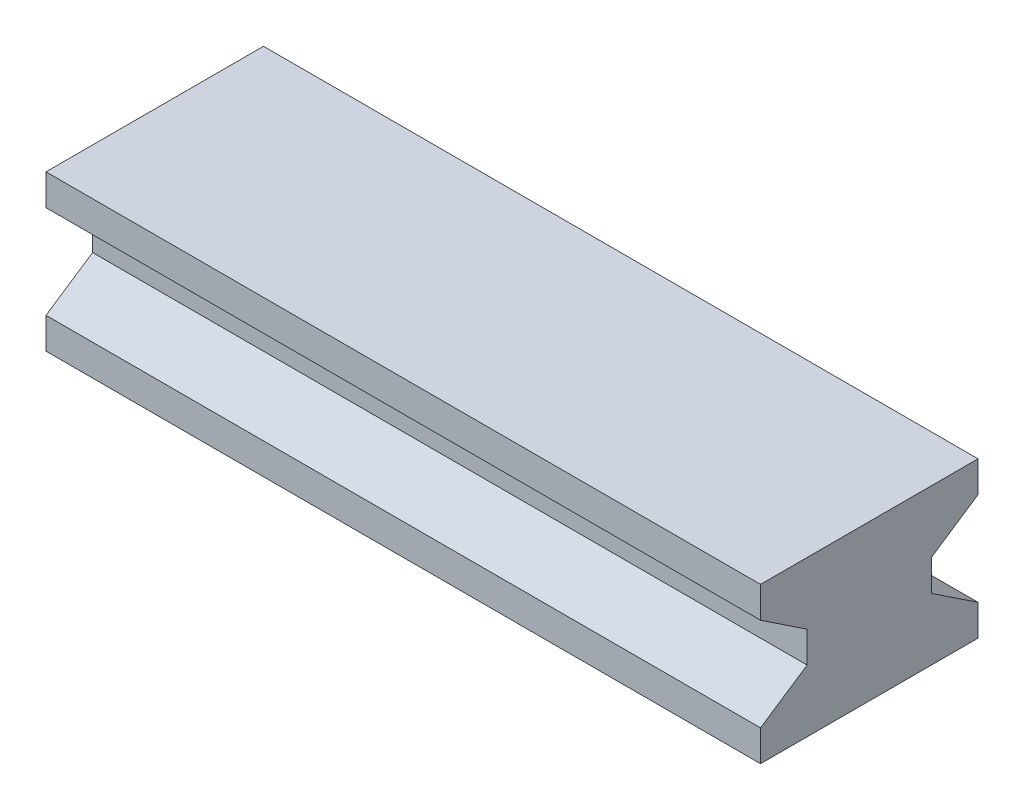
ISO-10303-21;
HEADER;
FILE_DESCRIPTION(('STEP AP214'),'2;1');
FILE_NAME('part.step','',(''),(''),'','','');
FILE_SCHEMA(('AUTOMOTIVE_DESIGN { 1 0 10303 214 1 1 1 1 }'));
ENDSEC;
DATA;
#1=APPLICATION_CONTEXT('core data for automotive mechanical design processes');
#2=APPLICATION_PROTOCOL_DEFINITION('international standard','automotive_design',2000,#1);
#3=PRODUCT_CONTEXT('',#1,'mechanical');
#4=PRODUCT('Part','Part','',(#3));
#5=PRODUCT_RELATED_PRODUCT_CATEGORY('part','',(#4));
#6=PRODUCT_DEFINITION_FORMATION('','',#4);
#7=PRODUCT_DEFINITION_CONTEXT('part definition',#1,'design');
#8=PRODUCT_DEFINITION('design','',#6,#7);
#9=PRODUCT_DEFINITION_SHAPE('','',#8);
#10=(LENGTH_UNIT() NAMED_UNIT(*) SI_UNIT(.MILLI.,.METRE.));
#11=(NAMED_UNIT(*) PLANE_ANGLE_UNIT() SI_UNIT($,.RADIAN.));
#12=(NAMED_UNIT(*) SI_UNIT($,.STERADIAN.) SOLID_ANGLE_UNIT());
#13=UNCERTAINTY_MEASURE_WITH_UNIT(LENGTH_MEASURE(1.E-05),#10,'distance_accuracy_value','');
#14=(GEOMETRIC_REPRESENTATION_CONTEXT(3) GLOBAL_UNCERTAINTY_ASSIGNED_CONTEXT((#13)) GLOBAL_UNIT_ASSIGNED_CONTEXT((#10,
#11,#12)) REPRESENTATION_CONTEXT('',''));
#15=CARTESIAN_POINT('',(0.,0.,0.));
#16=DIRECTION('',(0.,0.,1.));
#17=DIRECTION('',(1.,0.,0.));
#18=AXIS2_PLACEMENT_3D('',#15,#16,#17);
#19=CARTESIAN_POINT('',(230.,-5.76923076922906,-3.84615384615075));
#20=DIRECTION('',(0.,-0.832050294337974,-0.554700196225034));
#21=DIRECTION('',(0.,0.554700196225034,-0.832050294337974));
#22=AXIS2_PLACEMENT_3D('',#19,#20,#21);
#23=PLANE('',#22);
#24=DIRECTION('',(0.,-0.554700196225034,0.832050294337974));
#25=VECTOR('',#24,1.);
#26=CARTESIAN_POINT('',(0.,-5.76923076922906,-3.84615384615075));
#27=LINE('',#26,#25);
#28=CARTESIAN_POINT('',(0.,14.9999999999932,-35.));
#29=VERTEX_POINT('',#28);
#30=CARTESIAN_POINT('',(0.,4.99999999999984,-20.0000000000023));
#31=VERTEX_POINT('',#30);
#32=EDGE_CURVE('E157',#29,#31,#27,.T.);
#33=ORIENTED_EDGE('',*,*,#32,.F.);
#34=DIRECTION('',(-1.,0.,0.));
#35=VECTOR('',#34,1.);
#36=CARTESIAN_POINT('',(230.,14.9999999999932,-35.));
#37=LINE('',#36,#35);
#38=CARTESIAN_POINT('',(230.,14.9999999999932,-35.));
#39=VERTEX_POINT('',#38);
#40=EDGE_CURVE('E11',#39,#29,#37,.T.);
#41=ORIENTED_EDGE('',*,*,#40,.F.);
#42=DIRECTION('',(0.,-0.554700196225034,0.832050294337974));
#43=VECTOR('',#42,1.);
#44=CARTESIAN_POINT('',(230.,-5.76923076922906,-3.84615384615075));
#45=LINE('',#44,#43);
#46=CARTESIAN_POINT('',(230.,4.99999999999984,-20.0000000000023));
#47=VERTEX_POINT('',#46);
#48=EDGE_CURVE('E185',#39,#47,#45,.T.);
#49=ORIENTED_EDGE('',*,*,#48,.T.);
#50=DIRECTION('',(-1.,0.,0.));
#51=VECTOR('',#50,1.);
#52=CARTESIAN_POINT('',(230.,4.99999999999984,-20.0000000000023));
#53=LINE('',#52,#51);
#54=EDGE_CURVE('E52',#47,#31,#53,.T.);
#55=ORIENTED_EDGE('',*,*,#54,.T.);
#56=EDGE_LOOP('',(#33,#41,#49,#55));
#57=FACE_BOUND('',#56,.T.);
#58=ADVANCED_FACE('F36',(#57),#23,.T.);
#59=CARTESIAN_POINT('',(230.,0.,-35.));
#60=DIRECTION('',(0.,0.,1.));
#61=DIRECTION('',(1.,0.,0.));
#62=AXIS2_PLACEMENT_3D('',#59,#60,#61);
#63=PLANE('',#62);
#64=DIRECTION('',(0.,1.,0.));
#65=VECTOR('',#64,1.);
#66=CARTESIAN_POINT('',(0.,0.,-35.));
#67=LINE('',#66,#65);
#68=CARTESIAN_POINT('',(0.,25.,-35.));
#69=VERTEX_POINT('',#68);
#70=EDGE_CURVE('E159',#29,#69,#67,.T.);
#71=ORIENTED_EDGE('',*,*,#70,.T.);
#72=DIRECTION('',(-1.,0.,0.));
#73=VECTOR('',#72,1.);
#74=CARTESIAN_POINT('',(230.,25.,-35.));
#75=LINE('',#74,#73);
#76=CARTESIAN_POINT('',(230.,25.,-35.));
#77=VERTEX_POINT('',#76);
#78=EDGE_CURVE('E44',#77,#69,#75,.T.);
#79=ORIENTED_EDGE('',*,*,#78,.F.);
#80=DIRECTION('',(0.,1.,0.));
#81=VECTOR('',#80,1.);
#82=CARTESIAN_POINT('',(230.,0.,-35.));
#83=LINE('',#82,#81);
#84=EDGE_CURVE('E140',#39,#77,#83,.T.);
#85=ORIENTED_EDGE('',*,*,#84,.F.);
#86=ORIENTED_EDGE('',*,*,#40,.T.);
#87=EDGE_LOOP('',(#71,#79,#85,#86));
#88=FACE_BOUND('',#87,.T.);
#89=ADVANCED_FACE('F209',(#88),#63,.F.);
#90=CARTESIAN_POINT('',(230.,25.,0.));
#91=DIRECTION('',(0.,1.,0.));
#92=DIRECTION('',(0.,0.,1.));
#93=AXIS2_PLACEMENT_3D('',#90,#91,#92);
#94=PLANE('',#93);
#95=DIRECTION('',(0.,0.,-1.));
#96=VECTOR('',#95,1.);
#97=CARTESIAN_POINT('',(0.,25.,0.));
#98=LINE('',#97,#96);
#99=CARTESIAN_POINT('',(0.,25.,35.));
#100=VERTEX_POINT('',#99);
#101=EDGE_CURVE('E162',#100,#69,#98,.T.);
#102=ORIENTED_EDGE('',*,*,#101,.F.);
#103=DIRECTION('',(-1.,0.,0.));
#104=VECTOR('',#103,1.);
#105=CARTESIAN_POINT('',(230.,25.,35.));
#106=LINE('',#105,#104);
#107=CARTESIAN_POINT('',(230.,25.,35.));
#108=VERTEX_POINT('',#107);
#109=EDGE_CURVE('E199',#108,#100,#106,.T.);
#110=ORIENTED_EDGE('',*,*,#109,.F.);
#111=DIRECTION('',(0.,0.,-1.));
#112=VECTOR('',#111,1.);
#113=CARTESIAN_POINT('',(230.,25.,0.));
#114=LINE('',#113,#112);
#115=EDGE_CURVE('E206',#108,#77,#114,.T.);
#116=ORIENTED_EDGE('',*,*,#115,.T.);
#117=ORIENTED_EDGE('',*,*,#78,.T.);
#118=EDGE_LOOP('',(#102,#110,#116,#117));
#119=FACE_BOUND('',#118,.T.);
#120=ADVANCED_FACE('F204',(#119),#94,.T.);
#121=CARTESIAN_POINT('',(230.,0.,35.));
#122=DIRECTION('',(0.,0.,1.));
#123=DIRECTION('',(1.,0.,0.));
#124=AXIS2_PLACEMENT_3D('',#121,#122,#123);
#125=PLANE('',#124);
#126=DIRECTION('',(0.,1.,0.));
#127=VECTOR('',#126,1.);
#128=CARTESIAN_POINT('',(0.,0.,35.));
#129=LINE('',#128,#127);
#130=CARTESIAN_POINT('',(0.,15.,35.));
#131=VERTEX_POINT('',#130);
#132=EDGE_CURVE('E165',#131,#100,#129,.T.);
#133=ORIENTED_EDGE('',*,*,#132,.F.);
#134=DIRECTION('',(-1.,0.,0.));
#135=VECTOR('',#134,1.);
#136=CARTESIAN_POINT('',(230.,15.,35.));
#137=LINE('',#136,#135);
#138=CARTESIAN_POINT('',(230.,15.,35.));
#139=VERTEX_POINT('',#138);
#140=EDGE_CURVE('E197',#139,#131,#137,.T.);
#141=ORIENTED_EDGE('',*,*,#140,.F.);
#142=DIRECTION('',(0.,1.,0.));
#143=VECTOR('',#142,1.);
#144=CARTESIAN_POINT('',(230.,0.,35.));
#145=LINE('',#144,#143);
#146=EDGE_CURVE('E218',#139,#108,#145,.T.);
#147=ORIENTED_EDGE('',*,*,#146,.T.);
#148=ORIENTED_EDGE('',*,*,#109,.T.);
#149=EDGE_LOOP('',(#133,#141,#147,#148));
#150=FACE_BOUND('',#149,.T.);
#151=ADVANCED_FACE('F215',(#150),#125,.T.);
#152=CARTESIAN_POINT('',(230.,-5.76923076923077,3.84615384615385));
#153=DIRECTION('',(0.,-0.832050294337843,0.554700196225229));
#154=DIRECTION('',(0.,-0.554700196225229,-0.832050294337844));
#155=AXIS2_PLACEMENT_3D('',#152,#153,#154);
#156=PLANE('',#155);
#157=DIRECTION('',(0.,0.554700196225229,0.832050294337844));
#158=VECTOR('',#157,1.);
#159=CARTESIAN_POINT('',(0.,-5.76923076923077,3.84615384615385));
#160=LINE('',#159,#158);
#161=CARTESIAN_POINT('',(0.,5.,20.));
#162=VERTEX_POINT('',#161);
#163=EDGE_CURVE('E168',#162,#131,#160,.T.);
#164=ORIENTED_EDGE('',*,*,#163,.F.);
#165=DIRECTION('',(-1.,0.,0.));
#166=VECTOR('',#165,1.);
#167=CARTESIAN_POINT('',(230.,5.,20.));
#168=LINE('',#167,#166);
#169=CARTESIAN_POINT('',(230.,5.,20.));
#170=VERTEX_POINT('',#169);
#171=EDGE_CURVE('E195',#170,#162,#168,.T.);
#172=ORIENTED_EDGE('',*,*,#171,.F.);
#173=DIRECTION('',(0.,0.554700196225229,0.832050294337844));
#174=VECTOR('',#173,1.);
#175=CARTESIAN_POINT('',(230.,-5.76923076923077,3.84615384615385));
#176=LINE('',#175,#174);
#177=EDGE_CURVE('E222',#170,#139,#176,.T.);
#178=ORIENTED_EDGE('',*,*,#177,.T.);
#179=ORIENTED_EDGE('',*,*,#140,.T.);
#180=EDGE_LOOP('',(#164,#172,#178,#179));
#181=FACE_BOUND('',#180,.T.);
#182=ADVANCED_FACE('F320',(#181),#156,.T.);
#183=CARTESIAN_POINT('',(230.,0.,20.));
#184=DIRECTION('',(0.,0.,1.));
#185=DIRECTION('',(1.,0.,0.));
#186=AXIS2_PLACEMENT_3D('',#183,#184,#185);
#187=PLANE('',#186);
#188=DIRECTION('',(0.,1.,0.));
#189=VECTOR('',#188,1.);
#190=CARTESIAN_POINT('',(0.,0.,20.));
#191=LINE('',#190,#189);
#192=CARTESIAN_POINT('',(0.,-4.99999999999999,20.));
#193=VERTEX_POINT('',#192);
#194=EDGE_CURVE('E172',#193,#162,#191,.T.);
#195=ORIENTED_EDGE('',*,*,#194,.F.);
#196=DIRECTION('',(-1.,0.,0.));
#197=VECTOR('',#196,1.);
#198=CARTESIAN_POINT('',(230.,-4.99999999999999,20.));
#199=LINE('',#198,#197);
#200=CARTESIAN_POINT('',(230.,-4.99999999999999,20.));
#201=VERTEX_POINT('',#200);
#202=EDGE_CURVE('E193',#201,#193,#199,.T.);
#203=ORIENTED_EDGE('',*,*,#202,.F.);
#204=DIRECTION('',(0.,1.,0.));
#205=VECTOR('',#204,1.);
#206=CARTESIAN_POINT('',(230.,0.,20.));
#207=LINE('',#206,#205);
#208=EDGE_CURVE('E228',#201,#170,#207,.T.);
#209=ORIENTED_EDGE('',*,*,#208,.T.);
#210=ORIENTED_EDGE('',*,*,#171,.T.);
#211=EDGE_LOOP('',(#195,#203,#209,#210));
#212=FACE_BOUND('',#211,.T.);
#213=ADVANCED_FACE('F242',(#212),#187,.T.);
#214=CARTESIAN_POINT('',(230.,5.76923076923078,3.84615384615385));
#215=DIRECTION('',(0.,0.832050294337843,0.554700196225229));
#216=DIRECTION('',(0.,-0.554700196225229,0.832050294337844));
#217=AXIS2_PLACEMENT_3D('',#214,#215,#216);
#218=PLANE('',#217);
#219=DIRECTION('',(0.,0.554700196225229,-0.832050294337844));
#220=VECTOR('',#219,1.);
#221=CARTESIAN_POINT('',(0.,5.76923076923078,3.84615384615385));
#222=LINE('',#221,#220);
#223=CARTESIAN_POINT('',(0.,-15.,35.));
#224=VERTEX_POINT('',#223);
#225=EDGE_CURVE('E175',#224,#193,#222,.T.);
#226=ORIENTED_EDGE('',*,*,#225,.F.);
#227=DIRECTION('',(-1.,0.,0.));
#228=VECTOR('',#227,1.);
#229=CARTESIAN_POINT('',(230.,-15.,35.));
#230=LINE('',#229,#228);
#231=CARTESIAN_POINT('',(230.,-15.,35.));
#232=VERTEX_POINT('',#231);
#233=EDGE_CURVE('E191',#232,#224,#230,.T.);
#234=ORIENTED_EDGE('',*,*,#233,.F.);
#235=DIRECTION('',(0.,0.554700196225229,-0.832050294337844));
#236=VECTOR('',#235,1.);
#237=CARTESIAN_POINT('',(230.,5.76923076923078,3.84615384615385));
#238=LINE('',#237,#236);
#239=EDGE_CURVE('E230',#232,#201,#238,.T.);
#240=ORIENTED_EDGE('',*,*,#239,.T.);
#241=ORIENTED_EDGE('',*,*,#202,.T.);
#242=EDGE_LOOP('',(#226,#234,#240,#241));
#243=FACE_BOUND('',#242,.T.);
#244=ADVANCED_FACE('F243',(#243),#218,.T.);
#245=CARTESIAN_POINT('',(0.,-25.,35.));
#246=VERTEX_POINT('',#245);
#247=EDGE_CURVE('E169',#246,#224,#129,.T.);
#248=ORIENTED_EDGE('',*,*,#247,.F.);
#249=DIRECTION('',(-1.,0.,0.));
#250=VECTOR('',#249,1.);
#251=CARTESIAN_POINT('',(230.,-25.,35.));
#252=LINE('',#251,#250);
#253=CARTESIAN_POINT('',(230.,-25.,35.));
#254=VERTEX_POINT('',#253);
#255=EDGE_CURVE('E189',#254,#246,#252,.T.);
#256=ORIENTED_EDGE('',*,*,#255,.F.);
#257=EDGE_CURVE('E224',#254,#232,#145,.T.);
#258=ORIENTED_EDGE('',*,*,#257,.T.);
#259=ORIENTED_EDGE('',*,*,#233,.T.);
#260=EDGE_LOOP('',(#248,#256,#258,#259));
#261=FACE_BOUND('',#260,.T.);
#262=ADVANCED_FACE('F237',(#261),#125,.T.);
#263=CARTESIAN_POINT('',(230.,-25.,0.));
#264=DIRECTION('',(0.,1.,0.));
#265=DIRECTION('',(0.,0.,1.));
#266=AXIS2_PLACEMENT_3D('',#263,#264,#265);
#267=PLANE('',#266);
#268=DIRECTION('',(0.,0.,-1.));
#269=VECTOR('',#268,1.);
#270=CARTESIAN_POINT('',(0.,-25.,0.));
#271=LINE('',#270,#269);
#272=CARTESIAN_POINT('',(0.,-25.,-35.));
#273=VERTEX_POINT('',#272);
#274=EDGE_CURVE('E178',#246,#273,#271,.T.);
#275=ORIENTED_EDGE('',*,*,#274,.T.);
#276=DIRECTION('',(-1.,0.,0.));
#277=VECTOR('',#276,1.);
#278=CARTESIAN_POINT('',(230.,-25.,-35.));
#279=LINE('',#278,#277);
#280=CARTESIAN_POINT('',(230.,-25.,-35.));
#281=VERTEX_POINT('',#280);
#282=EDGE_CURVE('E148',#281,#273,#279,.T.);
#283=ORIENTED_EDGE('',*,*,#282,.F.);
#284=DIRECTION('',(0.,0.,-1.));
#285=VECTOR('',#284,1.);
#286=CARTESIAN_POINT('',(230.,-25.,0.));
#287=LINE('',#286,#285);
#288=EDGE_CURVE('E135',#254,#281,#287,.T.);
#289=ORIENTED_EDGE('',*,*,#288,.F.);
#290=ORIENTED_EDGE('',*,*,#255,.T.);
#291=EDGE_LOOP('',(#275,#283,#289,#290));
#292=FACE_BOUND('',#291,.T.);
#293=ADVANCED_FACE('F247',(#292),#267,.F.);
#294=CARTESIAN_POINT('',(0.,-15.0000000000053,-35.));
#295=VERTEX_POINT('',#294);
#296=EDGE_CURVE('E145',#273,#295,#67,.T.);
#297=ORIENTED_EDGE('',*,*,#296,.T.);
#298=DIRECTION('',(-1.,0.,0.));
#299=VECTOR('',#298,1.);
#300=CARTESIAN_POINT('',(230.,-15.0000000000053,-35.));
#301=LINE('',#300,#299);
#302=CARTESIAN_POINT('',(230.,-15.0000000000053,-35.));
#303=VERTEX_POINT('',#302);
#304=EDGE_CURVE('E142',#303,#295,#301,.T.);
#305=ORIENTED_EDGE('',*,*,#304,.F.);
#306=EDGE_CURVE('E126',#281,#303,#83,.T.);
#307=ORIENTED_EDGE('',*,*,#306,.F.);
#308=ORIENTED_EDGE('',*,*,#282,.T.);
#309=EDGE_LOOP('',(#297,#305,#307,#308));
#310=FACE_BOUND('',#309,.T.);
#311=ADVANCED_FACE('F143',(#310),#63,.F.);
#312=CARTESIAN_POINT('',(230.,5.76923076923355,-3.84615384615766));
#313=DIRECTION('',(0.,0.832050294337713,-0.554700196225425));
#314=DIRECTION('',(0.,0.554700196225425,0.832050294337713));
#315=AXIS2_PLACEMENT_3D('',#312,#313,#314);
#316=PLANE('',#315);
#317=DIRECTION('',(0.,-0.554700196225425,-0.832050294337713));
#318=VECTOR('',#317,1.);
#319=CARTESIAN_POINT('',(0.,5.76923076923355,-3.84615384615766));
#320=LINE('',#319,#318);
#321=CARTESIAN_POINT('',(0.,-5.00000000000014,-20.));
#322=VERTEX_POINT('',#321);
#323=EDGE_CURVE('E180',#322,#295,#320,.T.);
#324=ORIENTED_EDGE('',*,*,#323,.F.);
#325=DIRECTION('',(-1.,0.,0.));
#326=VECTOR('',#325,1.);
#327=CARTESIAN_POINT('',(230.,-5.00000000000014,-20.));
#328=LINE('',#327,#326);
#329=CARTESIAN_POINT('',(230.,-5.00000000000014,-20.));
#330=VERTEX_POINT('',#329);
#331=EDGE_CURVE('E89',#330,#322,#328,.T.);
#332=ORIENTED_EDGE('',*,*,#331,.F.);
#333=DIRECTION('',(0.,-0.554700196225425,-0.832050294337713));
#334=VECTOR('',#333,1.);
#335=CARTESIAN_POINT('',(230.,5.76923076923355,-3.84615384615766));
#336=LINE('',#335,#334);
#337=EDGE_CURVE('E132',#330,#303,#336,.T.);
#338=ORIENTED_EDGE('',*,*,#337,.T.);
#339=ORIENTED_EDGE('',*,*,#304,.T.);
#340=EDGE_LOOP('',(#324,#332,#338,#339));
#341=FACE_BOUND('',#340,.T.);
#342=ADVANCED_FACE('F150',(#341),#316,.T.);
#343=CARTESIAN_POINT('',(230.,-4.69069227904156E-12,-20.0000000000011));
#344=DIRECTION('',(0.,-2.34534613952065E-13,-1.));
#345=DIRECTION('',(0.,1.,-2.34534613952065E-13));
#346=AXIS2_PLACEMENT_3D('',#343,#344,#345);
#347=PLANE('',#346);
#348=DIRECTION('',(0.,-1.,2.34534613952065E-13));
#349=VECTOR('',#348,1.);
#350=CARTESIAN_POINT('',(0.,-4.69069227904156E-12,-20.0000000000011));
#351=LINE('',#350,#349);
#352=EDGE_CURVE('E182',#31,#322,#351,.T.);
#353=ORIENTED_EDGE('',*,*,#352,.F.);
#354=ORIENTED_EDGE('',*,*,#54,.F.);
#355=DIRECTION('',(0.,-1.,2.34534613952065E-13));
#356=VECTOR('',#355,1.);
#357=CARTESIAN_POINT('',(230.,-4.69069227904156E-12,-20.0000000000011));
#358=LINE('',#357,#356);
#359=EDGE_CURVE('E151',#47,#330,#358,.T.);
#360=ORIENTED_EDGE('',*,*,#359,.T.);
#361=ORIENTED_EDGE('',*,*,#331,.T.);
#362=EDGE_LOOP('',(#353,#354,#360,#361));
#363=FACE_BOUND('',#362,.T.);
#364=ADVANCED_FACE('F260',(#363),#347,.T.);
#365=CARTESIAN_POINT('',(230.,0.,0.));
#366=DIRECTION('',(1.,0.,0.));
#367=DIRECTION('',(0.,0.,-1.));
#368=AXIS2_PLACEMENT_3D('',#365,#366,#367);
#369=PLANE('',#368);
#370=ORIENTED_EDGE('',*,*,#48,.F.);
#371=ORIENTED_EDGE('',*,*,#84,.T.);
#372=ORIENTED_EDGE('',*,*,#115,.F.);
#373=ORIENTED_EDGE('',*,*,#146,.F.);
#374=ORIENTED_EDGE('',*,*,#177,.F.);
#375=ORIENTED_EDGE('',*,*,#208,.F.);
#376=ORIENTED_EDGE('',*,*,#239,.F.);
#377=ORIENTED_EDGE('',*,*,#257,.F.);
#378=ORIENTED_EDGE('',*,*,#288,.T.);
#379=ORIENTED_EDGE('',*,*,#306,.T.);
#380=ORIENTED_EDGE('',*,*,#337,.F.);
#381=ORIENTED_EDGE('',*,*,#359,.F.);
#382=EDGE_LOOP('',(#370,#371,#372,#373,#374,#375,#376,#377,#378,#379,#380,#381));
#383=FACE_BOUND('',#382,.T.);
#384=ADVANCED_FACE('F129',(#383),#369,.T.);
#385=CARTESIAN_POINT('',(0.,0.,0.));
#386=DIRECTION('',(1.,0.,0.));
#387=DIRECTION('',(0.,0.,-1.));
#388=AXIS2_PLACEMENT_3D('',#385,#386,#387);
#389=PLANE('',#388);
#390=ORIENTED_EDGE('',*,*,#32,.T.);
#391=ORIENTED_EDGE('',*,*,#352,.T.);
#392=ORIENTED_EDGE('',*,*,#323,.T.);
#393=ORIENTED_EDGE('',*,*,#296,.F.);
#394=ORIENTED_EDGE('',*,*,#274,.F.);
#395=ORIENTED_EDGE('',*,*,#247,.T.);
#396=ORIENTED_EDGE('',*,*,#225,.T.);
#397=ORIENTED_EDGE('',*,*,#194,.T.);
#398=ORIENTED_EDGE('',*,*,#163,.T.);
#399=ORIENTED_EDGE('',*,*,#132,.T.);
#400=ORIENTED_EDGE('',*,*,#101,.T.);
#401=ORIENTED_EDGE('',*,*,#70,.F.);
#402=EDGE_LOOP('',(#390,#391,#392,#393,#394,#395,#396,#397,#398,#399,#400,#401));
#403=FACE_BOUND('',#402,.T.);
#404=ADVANCED_FACE('F211',(#403),#389,.F.);
#405=CLOSED_SHELL('',(#58,#89,#120,#151,#182,#213,#244,#262,#293,#311,#342,#364,#384,#404));
#406=MANIFOLD_SOLID_BREP('B2',#405);
#407=ADVANCED_BREP_SHAPE_REPRESENTATION('',(#18,#406),#14);
#408=SHAPE_DEFINITION_REPRESENTATION(#9,#407);
ENDSEC;
END-ISO-10303-21;
